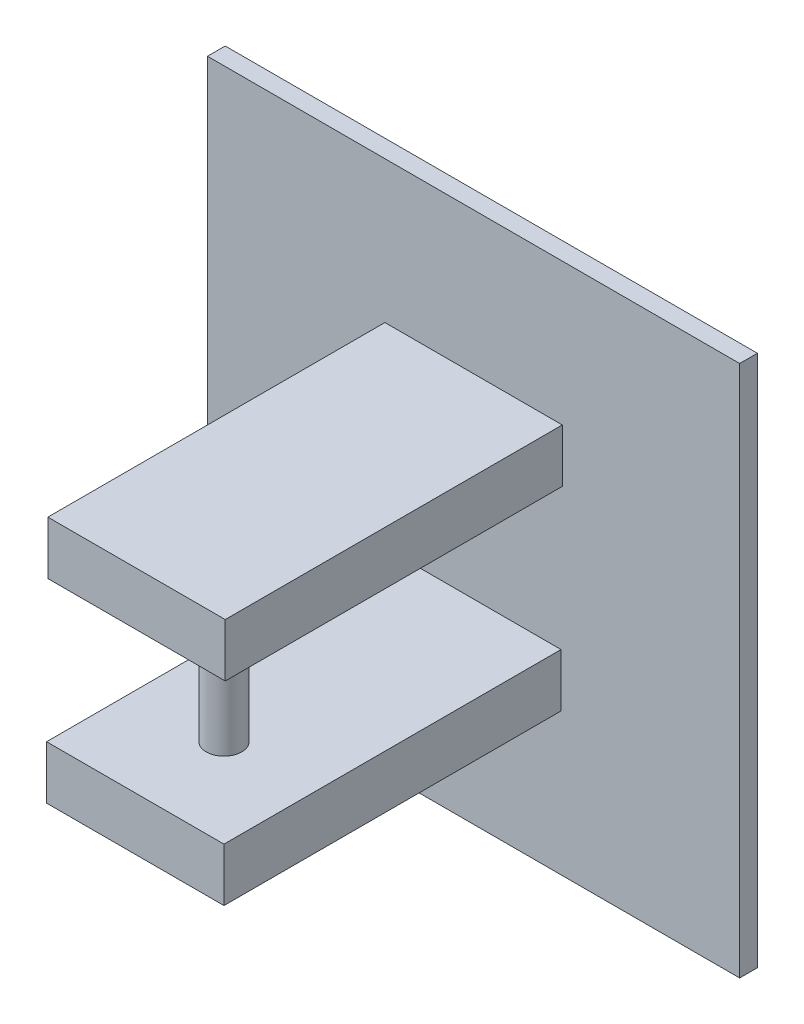
ISO-10303-21;
HEADER;
FILE_DESCRIPTION(('STEP AP214'),'2;1');
FILE_NAME('part.step','',(''),(''),'','','');
FILE_SCHEMA(('AUTOMOTIVE_DESIGN { 1 0 10303 214 1 1 1 1 }'));
ENDSEC;
DATA;
#1=APPLICATION_CONTEXT('core data for automotive mechanical design processes');
#2=APPLICATION_PROTOCOL_DEFINITION('international standard','automotive_design',2000,#1);
#3=PRODUCT_CONTEXT('',#1,'mechanical');
#4=PRODUCT('Part','Part','',(#3));
#5=PRODUCT_RELATED_PRODUCT_CATEGORY('part','',(#4));
#6=PRODUCT_DEFINITION_FORMATION('','',#4);
#7=PRODUCT_DEFINITION_CONTEXT('part definition',#1,'design');
#8=PRODUCT_DEFINITION('design','',#6,#7);
#9=PRODUCT_DEFINITION_SHAPE('','',#8);
#10=(LENGTH_UNIT() NAMED_UNIT(*) SI_UNIT(.MILLI.,.METRE.));
#11=(NAMED_UNIT(*) PLANE_ANGLE_UNIT() SI_UNIT($,.RADIAN.));
#12=(NAMED_UNIT(*) SI_UNIT($,.STERADIAN.) SOLID_ANGLE_UNIT());
#13=UNCERTAINTY_MEASURE_WITH_UNIT(LENGTH_MEASURE(1.E-05),#10,'distance_accuracy_value','');
#14=(GEOMETRIC_REPRESENTATION_CONTEXT(3) GLOBAL_UNCERTAINTY_ASSIGNED_CONTEXT((#13)) GLOBAL_UNIT_ASSIGNED_CONTEXT((#10,
#11,#12)) REPRESENTATION_CONTEXT('',''));
#15=CARTESIAN_POINT('',(0.,0.,0.));
#16=DIRECTION('',(0.,0.,1.));
#17=DIRECTION('',(1.,0.,0.));
#18=AXIS2_PLACEMENT_3D('',#15,#16,#17);
#19=CARTESIAN_POINT('',(0.,0.,0.));
#20=DIRECTION('',(0.,0.,1.));
#21=DIRECTION('',(1.,0.,0.));
#22=AXIS2_PLACEMENT_3D('',#19,#20,#21);
#23=PLANE('',#22);
#24=DIRECTION('',(0.,-1.,0.));
#25=VECTOR('',#24,1.);
#26=CARTESIAN_POINT('',(0.,150.,0.));
#27=LINE('',#26,#25);
#28=CARTESIAN_POINT('',(0.,150.,0.));
#29=VERTEX_POINT('',#28);
#30=CARTESIAN_POINT('',(0.,0.,0.));
#31=VERTEX_POINT('',#30);
#32=EDGE_CURVE('E184',#29,#31,#27,.T.);
#33=ORIENTED_EDGE('',*,*,#32,.T.);
#34=DIRECTION('',(1.,0.,0.));
#35=VECTOR('',#34,1.);
#36=CARTESIAN_POINT('',(0.,0.,0.));
#37=LINE('',#36,#35);
#38=CARTESIAN_POINT('',(150.,0.,0.));
#39=VERTEX_POINT('',#38);
#40=EDGE_CURVE('E201',#31,#39,#37,.T.);
#41=ORIENTED_EDGE('',*,*,#40,.T.);
#42=DIRECTION('',(0.,1.,0.));
#43=VECTOR('',#42,1.);
#44=CARTESIAN_POINT('',(150.,0.,0.));
#45=LINE('',#44,#43);
#46=CARTESIAN_POINT('',(150.,150.,0.));
#47=VERTEX_POINT('',#46);
#48=EDGE_CURVE('E204',#39,#47,#45,.T.);
#49=ORIENTED_EDGE('',*,*,#48,.T.);
#50=DIRECTION('',(-1.,0.,0.));
#51=VECTOR('',#50,1.);
#52=CARTESIAN_POINT('',(150.,150.,0.));
#53=LINE('',#52,#51);
#54=EDGE_CURVE('E189',#47,#29,#53,.T.);
#55=ORIENTED_EDGE('',*,*,#54,.T.);
#56=EDGE_LOOP('',(#33,#41,#49,#55));
#57=FACE_BOUND('',#56,.T.);
#58=DIRECTION('',(0.,-1.,0.));
#59=VECTOR('',#58,1.);
#60=CARTESIAN_POINT('',(49.6430129268058,55.,0.));
#61=LINE('',#60,#59);
#62=CARTESIAN_POINT('',(49.6430129268058,55.,0.));
#63=VERTEX_POINT('',#62);
#64=CARTESIAN_POINT('',(49.6430129268058,40.,0.));
#65=VERTEX_POINT('',#64);
#66=EDGE_CURVE('E156',#63,#65,#61,.T.);
#67=ORIENTED_EDGE('',*,*,#66,.F.);
#68=DIRECTION('',(-1.,0.,0.));
#69=VECTOR('',#68,1.);
#70=CARTESIAN_POINT('',(99.6430129268058,55.,0.));
#71=LINE('',#70,#69);
#72=CARTESIAN_POINT('',(99.6430129268058,55.,0.));
#73=VERTEX_POINT('',#72);
#74=EDGE_CURVE('E153',#73,#63,#71,.T.);
#75=ORIENTED_EDGE('',*,*,#74,.F.);
#76=DIRECTION('',(0.,1.,0.));
#77=VECTOR('',#76,1.);
#78=CARTESIAN_POINT('',(99.6430129268058,40.,0.));
#79=LINE('',#78,#77);
#80=CARTESIAN_POINT('',(99.6430129268058,40.,0.));
#81=VERTEX_POINT('',#80);
#82=EDGE_CURVE('E165',#81,#73,#79,.T.);
#83=ORIENTED_EDGE('',*,*,#82,.F.);
#84=DIRECTION('',(1.,0.,0.));
#85=VECTOR('',#84,1.);
#86=CARTESIAN_POINT('',(49.6430129268058,40.,0.));
#87=LINE('',#86,#85);
#88=EDGE_CURVE('E173',#65,#81,#87,.T.);
#89=ORIENTED_EDGE('',*,*,#88,.F.);
#90=EDGE_LOOP('',(#67,#75,#83,#89));
#91=FACE_BOUND('',#90,.T.);
#92=DIRECTION('',(0.,-1.,0.));
#93=VECTOR('',#92,1.);
#94=CARTESIAN_POINT('',(50.,110.,0.));
#95=LINE('',#94,#93);
#96=CARTESIAN_POINT('',(50.,110.,0.));
#97=VERTEX_POINT('',#96);
#98=CARTESIAN_POINT('',(50.,95.,0.));
#99=VERTEX_POINT('',#98);
#100=EDGE_CURVE('E289',#97,#99,#95,.T.);
#101=ORIENTED_EDGE('',*,*,#100,.F.);
#102=DIRECTION('',(-1.,0.,0.));
#103=VECTOR('',#102,1.);
#104=CARTESIAN_POINT('',(100.,110.,0.));
#105=LINE('',#104,#103);
#106=CARTESIAN_POINT('',(100.,110.,0.));
#107=VERTEX_POINT('',#106);
#108=EDGE_CURVE('E151',#107,#97,#105,.T.);
#109=ORIENTED_EDGE('',*,*,#108,.F.);
#110=DIRECTION('',(0.,1.,0.));
#111=VECTOR('',#110,1.);
#112=CARTESIAN_POINT('',(100.,95.,0.));
#113=LINE('',#112,#111);
#114=CARTESIAN_POINT('',(100.,95.,0.));
#115=VERTEX_POINT('',#114);
#116=EDGE_CURVE('E147',#115,#107,#113,.T.);
#117=ORIENTED_EDGE('',*,*,#116,.F.);
#118=DIRECTION('',(1.,0.,0.));
#119=VECTOR('',#118,1.);
#120=CARTESIAN_POINT('',(50.,95.,0.));
#121=LINE('',#120,#119);
#122=EDGE_CURVE('E296',#99,#115,#121,.T.);
#123=ORIENTED_EDGE('',*,*,#122,.F.);
#124=EDGE_LOOP('',(#101,#109,#117,#123));
#125=FACE_BOUND('',#124,.T.);
#126=ADVANCED_FACE('F37',(#57,#91,#125),#23,.T.);
#127=CARTESIAN_POINT('',(0.,150.,-5.));
#128=DIRECTION('',(-1.,0.,0.));
#129=DIRECTION('',(0.,0.,1.));
#130=AXIS2_PLACEMENT_3D('',#127,#128,#129);
#131=PLANE('',#130);
#132=ORIENTED_EDGE('',*,*,#32,.F.);
#133=DIRECTION('',(0.,0.,1.));
#134=VECTOR('',#133,1.);
#135=CARTESIAN_POINT('',(0.,150.,-5.));
#136=LINE('',#135,#134);
#137=CARTESIAN_POINT('',(0.,150.,-5.));
#138=VERTEX_POINT('',#137);
#139=EDGE_CURVE('E11',#138,#29,#136,.T.);
#140=ORIENTED_EDGE('',*,*,#139,.F.);
#141=DIRECTION('',(0.,-1.,0.));
#142=VECTOR('',#141,1.);
#143=CARTESIAN_POINT('',(0.,150.,-5.));
#144=LINE('',#143,#142);
#145=CARTESIAN_POINT('',(0.,0.,-5.));
#146=VERTEX_POINT('',#145);
#147=EDGE_CURVE('E185',#138,#146,#144,.T.);
#148=ORIENTED_EDGE('',*,*,#147,.T.);
#149=DIRECTION('',(0.,0.,1.));
#150=VECTOR('',#149,1.);
#151=CARTESIAN_POINT('',(0.,0.,-5.));
#152=LINE('',#151,#150);
#153=EDGE_CURVE('E198',#146,#31,#152,.T.);
#154=ORIENTED_EDGE('',*,*,#153,.T.);
#155=EDGE_LOOP('',(#132,#140,#148,#154));
#156=FACE_BOUND('',#155,.T.);
#157=ADVANCED_FACE('F39',(#156),#131,.T.);
#158=CARTESIAN_POINT('',(150.,150.,-5.));
#159=DIRECTION('',(0.,1.,0.));
#160=DIRECTION('',(-1.,0.,0.));
#161=AXIS2_PLACEMENT_3D('',#158,#159,#160);
#162=PLANE('',#161);
#163=ORIENTED_EDGE('',*,*,#54,.F.);
#164=DIRECTION('',(0.,0.,1.));
#165=VECTOR('',#164,1.);
#166=CARTESIAN_POINT('',(150.,150.,-5.));
#167=LINE('',#166,#165);
#168=CARTESIAN_POINT('',(150.,150.,-5.));
#169=VERTEX_POINT('',#168);
#170=EDGE_CURVE('E46',#169,#47,#167,.T.);
#171=ORIENTED_EDGE('',*,*,#170,.F.);
#172=DIRECTION('',(-1.,0.,0.));
#173=VECTOR('',#172,1.);
#174=CARTESIAN_POINT('',(150.,150.,-5.));
#175=LINE('',#174,#173);
#176=EDGE_CURVE('E195',#169,#138,#175,.T.);
#177=ORIENTED_EDGE('',*,*,#176,.T.);
#178=ORIENTED_EDGE('',*,*,#139,.T.);
#179=EDGE_LOOP('',(#163,#171,#177,#178));
#180=FACE_BOUND('',#179,.T.);
#181=ADVANCED_FACE('F223',(#180),#162,.T.);
#182=CARTESIAN_POINT('',(150.,0.,-5.));
#183=DIRECTION('',(1.,0.,0.));
#184=DIRECTION('',(0.,1.,0.));
#185=AXIS2_PLACEMENT_3D('',#182,#183,#184);
#186=PLANE('',#185);
#187=ORIENTED_EDGE('',*,*,#48,.F.);
#188=DIRECTION('',(0.,0.,1.));
#189=VECTOR('',#188,1.);
#190=CARTESIAN_POINT('',(150.,0.,-5.));
#191=LINE('',#190,#189);
#192=CARTESIAN_POINT('',(150.,0.,-5.));
#193=VERTEX_POINT('',#192);
#194=EDGE_CURVE('E210',#193,#39,#191,.T.);
#195=ORIENTED_EDGE('',*,*,#194,.F.);
#196=DIRECTION('',(0.,1.,0.));
#197=VECTOR('',#196,1.);
#198=CARTESIAN_POINT('',(150.,0.,-5.));
#199=LINE('',#198,#197);
#200=EDGE_CURVE('E192',#193,#169,#199,.T.);
#201=ORIENTED_EDGE('',*,*,#200,.T.);
#202=ORIENTED_EDGE('',*,*,#170,.T.);
#203=EDGE_LOOP('',(#187,#195,#201,#202));
#204=FACE_BOUND('',#203,.T.);
#205=ADVANCED_FACE('F229',(#204),#186,.T.);
#206=CARTESIAN_POINT('',(0.,0.,-5.));
#207=DIRECTION('',(0.,-1.,0.));
#208=DIRECTION('',(0.,0.,-1.));
#209=AXIS2_PLACEMENT_3D('',#206,#207,#208);
#210=PLANE('',#209);
#211=ORIENTED_EDGE('',*,*,#40,.F.);
#212=ORIENTED_EDGE('',*,*,#153,.F.);
#213=DIRECTION('',(1.,0.,0.));
#214=VECTOR('',#213,1.);
#215=CARTESIAN_POINT('',(0.,0.,-5.));
#216=LINE('',#215,#214);
#217=EDGE_CURVE('E188',#146,#193,#216,.T.);
#218=ORIENTED_EDGE('',*,*,#217,.T.);
#219=ORIENTED_EDGE('',*,*,#194,.T.);
#220=EDGE_LOOP('',(#211,#212,#218,#219));
#221=FACE_BOUND('',#220,.T.);
#222=ADVANCED_FACE('F217',(#221),#210,.T.);
#223=CARTESIAN_POINT('',(0.,0.,-5.));
#224=DIRECTION('',(0.,0.,1.));
#225=DIRECTION('',(1.,0.,0.));
#226=AXIS2_PLACEMENT_3D('',#223,#224,#225);
#227=PLANE('',#226);
#228=ORIENTED_EDGE('',*,*,#147,.F.);
#229=ORIENTED_EDGE('',*,*,#176,.F.);
#230=ORIENTED_EDGE('',*,*,#200,.F.);
#231=ORIENTED_EDGE('',*,*,#217,.F.);
#232=EDGE_LOOP('',(#228,#229,#230,#231));
#233=FACE_BOUND('',#232,.T.);
#234=ADVANCED_FACE('F226',(#233),#227,.F.);
#235=CARTESIAN_POINT('',(99.6430129268058,55.,95.));
#236=DIRECTION('',(0.,-1.,0.));
#237=DIRECTION('',(0.,0.,-1.));
#238=AXIS2_PLACEMENT_3D('',#235,#236,#237);
#239=PLANE('',#238);
#240=CARTESIAN_POINT('',(74.6430129268058,55.,70.));
#241=DIRECTION('',(0.,-1.,0.));
#242=DIRECTION('',(0.,0.,-1.));
#243=AXIS2_PLACEMENT_3D('',#240,#241,#242);
#244=CIRCLE('',#243,5.00000000000001);
#245=CARTESIAN_POINT('',(74.6430129268058,55.,65.));
#246=VERTEX_POINT('',#245);
#247=EDGE_CURVE('E287',#246,#246,#244,.T.);
#248=ORIENTED_EDGE('',*,*,#247,.T.);
#249=EDGE_LOOP('',(#248));
#250=FACE_BOUND('',#249,.T.);
#251=ORIENTED_EDGE('',*,*,#74,.T.);
#252=DIRECTION('',(0.,0.,-1.));
#253=VECTOR('',#252,1.);
#254=CARTESIAN_POINT('',(49.6430129268058,55.,95.));
#255=LINE('',#254,#253);
#256=CARTESIAN_POINT('',(49.6430129268058,55.,95.));
#257=VERTEX_POINT('',#256);
#258=EDGE_CURVE('E182',#257,#63,#255,.T.);
#259=ORIENTED_EDGE('',*,*,#258,.F.);
#260=DIRECTION('',(-1.,0.,0.));
#261=VECTOR('',#260,1.);
#262=CARTESIAN_POINT('',(99.6430129268058,55.,95.));
#263=LINE('',#262,#261);
#264=CARTESIAN_POINT('',(99.6430129268058,55.,95.));
#265=VERTEX_POINT('',#264);
#266=EDGE_CURVE('E161',#265,#257,#263,.T.);
#267=ORIENTED_EDGE('',*,*,#266,.F.);
#268=DIRECTION('',(0.,0.,-1.));
#269=VECTOR('',#268,1.);
#270=CARTESIAN_POINT('',(99.6430129268058,55.,95.));
#271=LINE('',#270,#269);
#272=EDGE_CURVE('E170',#265,#73,#271,.T.);
#273=ORIENTED_EDGE('',*,*,#272,.T.);
#274=EDGE_LOOP('',(#251,#259,#267,#273));
#275=FACE_BOUND('',#274,.T.);
#276=ADVANCED_FACE('F245',(#250,#275),#239,.F.);
#277=CARTESIAN_POINT('',(49.6430129268058,55.,95.));
#278=DIRECTION('',(1.,0.,0.));
#279=DIRECTION('',(0.,1.,0.));
#280=AXIS2_PLACEMENT_3D('',#277,#278,#279);
#281=PLANE('',#280);
#282=ORIENTED_EDGE('',*,*,#66,.T.);
#283=DIRECTION('',(0.,0.,-1.));
#284=VECTOR('',#283,1.);
#285=CARTESIAN_POINT('',(49.6430129268058,40.,95.));
#286=LINE('',#285,#284);
#287=CARTESIAN_POINT('',(49.6430129268058,40.,95.));
#288=VERTEX_POINT('',#287);
#289=EDGE_CURVE('E179',#288,#65,#286,.T.);
#290=ORIENTED_EDGE('',*,*,#289,.F.);
#291=DIRECTION('',(0.,-1.,0.));
#292=VECTOR('',#291,1.);
#293=CARTESIAN_POINT('',(49.6430129268058,55.,95.));
#294=LINE('',#293,#292);
#295=EDGE_CURVE('E164',#257,#288,#294,.T.);
#296=ORIENTED_EDGE('',*,*,#295,.F.);
#297=ORIENTED_EDGE('',*,*,#258,.T.);
#298=EDGE_LOOP('',(#282,#290,#296,#297));
#299=FACE_BOUND('',#298,.T.);
#300=ADVANCED_FACE('F248',(#299),#281,.F.);
#301=CARTESIAN_POINT('',(49.6430129268058,40.,95.));
#302=DIRECTION('',(0.,1.,0.));
#303=DIRECTION('',(0.,0.,1.));
#304=AXIS2_PLACEMENT_3D('',#301,#302,#303);
#305=PLANE('',#304);
#306=ORIENTED_EDGE('',*,*,#88,.T.);
#307=DIRECTION('',(0.,0.,-1.));
#308=VECTOR('',#307,1.);
#309=CARTESIAN_POINT('',(99.6430129268058,40.,95.));
#310=LINE('',#309,#308);
#311=CARTESIAN_POINT('',(99.6430129268058,40.,95.));
#312=VERTEX_POINT('',#311);
#313=EDGE_CURVE('E62',#312,#81,#310,.T.);
#314=ORIENTED_EDGE('',*,*,#313,.F.);
#315=DIRECTION('',(1.,0.,0.));
#316=VECTOR('',#315,1.);
#317=CARTESIAN_POINT('',(49.6430129268058,40.,95.));
#318=LINE('',#317,#316);
#319=EDGE_CURVE('E167',#288,#312,#318,.T.);
#320=ORIENTED_EDGE('',*,*,#319,.F.);
#321=ORIENTED_EDGE('',*,*,#289,.T.);
#322=EDGE_LOOP('',(#306,#314,#320,#321));
#323=FACE_BOUND('',#322,.T.);
#324=ADVANCED_FACE('F252',(#323),#305,.F.);
#325=CARTESIAN_POINT('',(99.6430129268058,40.,95.));
#326=DIRECTION('',(-1.,0.,0.));
#327=DIRECTION('',(0.,-1.,0.));
#328=AXIS2_PLACEMENT_3D('',#325,#326,#327);
#329=PLANE('',#328);
#330=ORIENTED_EDGE('',*,*,#82,.T.);
#331=ORIENTED_EDGE('',*,*,#272,.F.);
#332=DIRECTION('',(0.,1.,0.));
#333=VECTOR('',#332,1.);
#334=CARTESIAN_POINT('',(99.6430129268058,40.,95.));
#335=LINE('',#334,#333);
#336=EDGE_CURVE('E169',#312,#265,#335,.T.);
#337=ORIENTED_EDGE('',*,*,#336,.F.);
#338=ORIENTED_EDGE('',*,*,#313,.T.);
#339=EDGE_LOOP('',(#330,#331,#337,#338));
#340=FACE_BOUND('',#339,.T.);
#341=ADVANCED_FACE('F256',(#340),#329,.F.);
#342=CARTESIAN_POINT('',(0.,0.,95.));
#343=DIRECTION('',(0.,0.,1.));
#344=DIRECTION('',(1.,0.,0.));
#345=AXIS2_PLACEMENT_3D('',#342,#343,#344);
#346=PLANE('',#345);
#347=ORIENTED_EDGE('',*,*,#266,.T.);
#348=ORIENTED_EDGE('',*,*,#295,.T.);
#349=ORIENTED_EDGE('',*,*,#319,.T.);
#350=ORIENTED_EDGE('',*,*,#336,.T.);
#351=EDGE_LOOP('',(#347,#348,#349,#350));
#352=FACE_BOUND('',#351,.T.);
#353=ADVANCED_FACE('F260',(#352),#346,.T.);
#354=CARTESIAN_POINT('',(100.,110.,95.));
#355=DIRECTION('',(0.,-1.,0.));
#356=DIRECTION('',(1.,0.,0.));
#357=AXIS2_PLACEMENT_3D('',#354,#355,#356);
#358=PLANE('',#357);
#359=ORIENTED_EDGE('',*,*,#108,.T.);
#360=DIRECTION('',(0.,0.,-1.));
#361=VECTOR('',#360,1.);
#362=CARTESIAN_POINT('',(50.,110.,95.));
#363=LINE('',#362,#361);
#364=CARTESIAN_POINT('',(50.,110.,95.));
#365=VERTEX_POINT('',#364);
#366=EDGE_CURVE('E132',#365,#97,#363,.T.);
#367=ORIENTED_EDGE('',*,*,#366,.F.);
#368=DIRECTION('',(-1.,0.,0.));
#369=VECTOR('',#368,1.);
#370=CARTESIAN_POINT('',(100.,110.,95.));
#371=LINE('',#370,#369);
#372=CARTESIAN_POINT('',(100.,110.,95.));
#373=VERTEX_POINT('',#372);
#374=EDGE_CURVE('E139',#373,#365,#371,.T.);
#375=ORIENTED_EDGE('',*,*,#374,.F.);
#376=DIRECTION('',(0.,0.,-1.));
#377=VECTOR('',#376,1.);
#378=CARTESIAN_POINT('',(100.,110.,95.));
#379=LINE('',#378,#377);
#380=EDGE_CURVE('E293',#373,#107,#379,.T.);
#381=ORIENTED_EDGE('',*,*,#380,.T.);
#382=EDGE_LOOP('',(#359,#367,#375,#381));
#383=FACE_BOUND('',#382,.T.);
#384=ADVANCED_FACE('F149',(#383),#358,.F.);
#385=CARTESIAN_POINT('',(50.,110.,95.));
#386=DIRECTION('',(1.,0.,0.));
#387=DIRECTION('',(0.,0.,-1.));
#388=AXIS2_PLACEMENT_3D('',#385,#386,#387);
#389=PLANE('',#388);
#390=ORIENTED_EDGE('',*,*,#100,.T.);
#391=DIRECTION('',(0.,0.,-1.));
#392=VECTOR('',#391,1.);
#393=CARTESIAN_POINT('',(50.,95.,95.));
#394=LINE('',#393,#392);
#395=CARTESIAN_POINT('',(50.,95.,95.));
#396=VERTEX_POINT('',#395);
#397=EDGE_CURVE('E135',#396,#99,#394,.T.);
#398=ORIENTED_EDGE('',*,*,#397,.F.);
#399=DIRECTION('',(0.,-1.,0.));
#400=VECTOR('',#399,1.);
#401=CARTESIAN_POINT('',(50.,110.,95.));
#402=LINE('',#401,#400);
#403=EDGE_CURVE('E128',#365,#396,#402,.T.);
#404=ORIENTED_EDGE('',*,*,#403,.F.);
#405=ORIENTED_EDGE('',*,*,#366,.T.);
#406=EDGE_LOOP('',(#390,#398,#404,#405));
#407=FACE_BOUND('',#406,.T.);
#408=ADVANCED_FACE('F130',(#407),#389,.F.);
#409=CARTESIAN_POINT('',(50.,95.,95.));
#410=DIRECTION('',(0.,1.,0.));
#411=DIRECTION('',(-1.,0.,0.));
#412=AXIS2_PLACEMENT_3D('',#409,#410,#411);
#413=PLANE('',#412);
#414=CARTESIAN_POINT('',(74.6430129268058,95.,70.));
#415=DIRECTION('',(0.,1.,0.));
#416=DIRECTION('',(-1.,0.,0.));
#417=AXIS2_PLACEMENT_3D('',#414,#415,#416);
#418=CIRCLE('',#417,5.00000000000001);
#419=CARTESIAN_POINT('',(69.6430129268058,95.,70.));
#420=VERTEX_POINT('',#419);
#421=EDGE_CURVE('E41',#420,#420,#418,.T.);
#422=ORIENTED_EDGE('',*,*,#421,.T.);
#423=EDGE_LOOP('',(#422));
#424=FACE_BOUND('',#423,.T.);
#425=ORIENTED_EDGE('',*,*,#122,.T.);
#426=DIRECTION('',(0.,0.,-1.));
#427=VECTOR('',#426,1.);
#428=CARTESIAN_POINT('',(100.,95.,95.));
#429=LINE('',#428,#427);
#430=CARTESIAN_POINT('',(100.,95.,95.));
#431=VERTEX_POINT('',#430);
#432=EDGE_CURVE('E54',#431,#115,#429,.T.);
#433=ORIENTED_EDGE('',*,*,#432,.F.);
#434=DIRECTION('',(1.,0.,0.));
#435=VECTOR('',#434,1.);
#436=CARTESIAN_POINT('',(50.,95.,95.));
#437=LINE('',#436,#435);
#438=EDGE_CURVE('E138',#396,#431,#437,.T.);
#439=ORIENTED_EDGE('',*,*,#438,.F.);
#440=ORIENTED_EDGE('',*,*,#397,.T.);
#441=EDGE_LOOP('',(#425,#433,#439,#440));
#442=FACE_BOUND('',#441,.T.);
#443=ADVANCED_FACE('F268',(#424,#442),#413,.F.);
#444=CARTESIAN_POINT('',(100.,95.,95.));
#445=DIRECTION('',(-1.,0.,0.));
#446=DIRECTION('',(0.,0.,1.));
#447=AXIS2_PLACEMENT_3D('',#444,#445,#446);
#448=PLANE('',#447);
#449=ORIENTED_EDGE('',*,*,#116,.T.);
#450=ORIENTED_EDGE('',*,*,#380,.F.);
#451=DIRECTION('',(0.,1.,0.));
#452=VECTOR('',#451,1.);
#453=CARTESIAN_POINT('',(100.,95.,95.));
#454=LINE('',#453,#452);
#455=EDGE_CURVE('E143',#431,#373,#454,.T.);
#456=ORIENTED_EDGE('',*,*,#455,.F.);
#457=ORIENTED_EDGE('',*,*,#432,.T.);
#458=EDGE_LOOP('',(#449,#450,#456,#457));
#459=FACE_BOUND('',#458,.T.);
#460=ADVANCED_FACE('F271',(#459),#448,.F.);
#461=CARTESIAN_POINT('',(0.,0.,95.));
#462=DIRECTION('',(0.,0.,1.));
#463=DIRECTION('',(1.,0.,0.));
#464=AXIS2_PLACEMENT_3D('',#461,#462,#463);
#465=PLANE('',#464);
#466=ORIENTED_EDGE('',*,*,#374,.T.);
#467=ORIENTED_EDGE('',*,*,#403,.T.);
#468=ORIENTED_EDGE('',*,*,#438,.T.);
#469=ORIENTED_EDGE('',*,*,#455,.T.);
#470=EDGE_LOOP('',(#466,#467,#468,#469));
#471=FACE_BOUND('',#470,.T.);
#472=ADVANCED_FACE('F142',(#471),#465,.T.);
#473=CARTESIAN_POINT('',(74.6430129268058,101.630141235865,70.));
#474=DIRECTION('',(0.,-1.,0.));
#475=DIRECTION('',(0.,0.,-1.));
#476=AXIS2_PLACEMENT_3D('',#473,#474,#475);
#477=CYLINDRICAL_SURFACE('',#476,5.00000000000001);
#478=ORIENTED_EDGE('',*,*,#421,.F.);
#479=EDGE_LOOP('',(#478));
#480=FACE_BOUND('',#479,.T.);
#481=ORIENTED_EDGE('',*,*,#247,.F.);
#482=EDGE_LOOP('',(#481));
#483=FACE_BOUND('',#482,.T.);
#484=ADVANCED_FACE('F277',(#480,#483),#477,.T.);
#485=CLOSED_SHELL('',(#126,#157,#181,#205,#222,#234,#276,#300,#324,#341,#353,#384,#408,#443,
#460,#472,#484));
#486=MANIFOLD_SOLID_BREP('B2',#485);
#487=ADVANCED_BREP_SHAPE_REPRESENTATION('',(#18,#486),#14);
#488=SHAPE_DEFINITION_REPRESENTATION(#9,#487);
ENDSEC;
END-ISO-10303-21;
